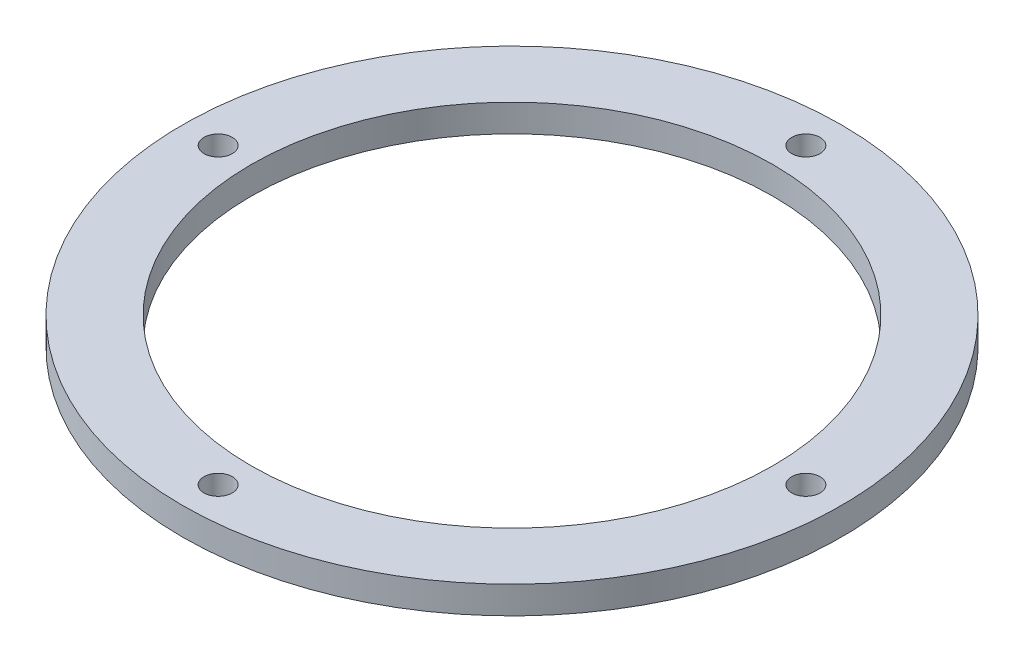
ISO-10303-21;
HEADER;
FILE_DESCRIPTION(('STEP AP214'),'2;1');
FILE_NAME('part.step','',(''),(''),'','','');
FILE_SCHEMA(('AUTOMOTIVE_DESIGN { 1 0 10303 214 1 1 1 1 }'));
ENDSEC;
DATA;
#1=APPLICATION_CONTEXT('core data for automotive mechanical design processes');
#2=APPLICATION_PROTOCOL_DEFINITION('international standard','automotive_design',2000,#1);
#3=PRODUCT_CONTEXT('',#1,'mechanical');
#4=PRODUCT('Part','Part','',(#3));
#5=PRODUCT_RELATED_PRODUCT_CATEGORY('part','',(#4));
#6=PRODUCT_DEFINITION_FORMATION('','',#4);
#7=PRODUCT_DEFINITION_CONTEXT('part definition',#1,'design');
#8=PRODUCT_DEFINITION('design','',#6,#7);
#9=PRODUCT_DEFINITION_SHAPE('','',#8);
#10=(LENGTH_UNIT() NAMED_UNIT(*) SI_UNIT(.MILLI.,.METRE.));
#11=(NAMED_UNIT(*) PLANE_ANGLE_UNIT() SI_UNIT($,.RADIAN.));
#12=(NAMED_UNIT(*) SI_UNIT($,.STERADIAN.) SOLID_ANGLE_UNIT());
#13=UNCERTAINTY_MEASURE_WITH_UNIT(LENGTH_MEASURE(1.E-05),#10,'distance_accuracy_value','');
#14=(GEOMETRIC_REPRESENTATION_CONTEXT(3) GLOBAL_UNCERTAINTY_ASSIGNED_CONTEXT((#13)) GLOBAL_UNIT_ASSIGNED_CONTEXT((#10,
#11,#12)) REPRESENTATION_CONTEXT('',''));
#15=CARTESIAN_POINT('',(0.,0.,0.));
#16=DIRECTION('',(0.,0.,1.));
#17=DIRECTION('',(1.,0.,0.));
#18=AXIS2_PLACEMENT_3D('',#15,#16,#17);
#19=CARTESIAN_POINT('',(0.,5.,0.));
#20=DIRECTION('',(0.,1.,0.));
#21=DIRECTION('',(0.,0.,1.));
#22=AXIS2_PLACEMENT_3D('',#19,#20,#21);
#23=PLANE('',#22);
#24=CARTESIAN_POINT('',(0.,5.,-53.5));
#25=DIRECTION('',(0.,1.,0.));
#26=DIRECTION('',(0.,0.,1.));
#27=AXIS2_PLACEMENT_3D('',#24,#25,#26);
#28=CIRCLE('',#27,2.575);
#29=CARTESIAN_POINT('',(0.,5.,-50.925));
#30=VERTEX_POINT('',#29);
#31=EDGE_CURVE('E85',#30,#30,#28,.T.);
#32=ORIENTED_EDGE('',*,*,#31,.F.);
#33=EDGE_LOOP('',(#32));
#34=FACE_BOUND('',#33,.T.);
#35=CARTESIAN_POINT('',(53.5,5.,1.86794251628108E-13));
#36=DIRECTION('',(0.,1.,0.));
#37=DIRECTION('',(0.,0.,1.));
#38=AXIS2_PLACEMENT_3D('',#35,#36,#37);
#39=CIRCLE('',#38,2.575);
#40=CARTESIAN_POINT('',(53.5,5.,2.57500000000019));
#41=VERTEX_POINT('',#40);
#42=EDGE_CURVE('E81',#41,#41,#39,.T.);
#43=ORIENTED_EDGE('',*,*,#42,.F.);
#44=EDGE_LOOP('',(#43));
#45=FACE_BOUND('',#44,.T.);
#46=CARTESIAN_POINT('',(-3.73588503256215E-13,5.,53.5));
#47=DIRECTION('',(0.,1.,0.));
#48=DIRECTION('',(0.,0.,1.));
#49=AXIS2_PLACEMENT_3D('',#46,#47,#48);
#50=CIRCLE('',#49,2.575);
#51=CARTESIAN_POINT('',(-3.73588503256215E-13,5.,56.075));
#52=VERTEX_POINT('',#51);
#53=EDGE_CURVE('E73',#52,#52,#50,.T.);
#54=ORIENTED_EDGE('',*,*,#53,.F.);
#55=EDGE_LOOP('',(#54));
#56=FACE_BOUND('',#55,.T.);
#57=CARTESIAN_POINT('',(-53.5,5.,-5.60382754884323E-13));
#58=DIRECTION('',(0.,1.,0.));
#59=DIRECTION('',(0.,0.,1.));
#60=AXIS2_PLACEMENT_3D('',#57,#58,#59);
#61=CIRCLE('',#60,2.575);
#62=CARTESIAN_POINT('',(-53.5,5.,2.57499999999944));
#63=VERTEX_POINT('',#62);
#64=EDGE_CURVE('E64',#63,#63,#61,.T.);
#65=ORIENTED_EDGE('',*,*,#64,.F.);
#66=EDGE_LOOP('',(#65));
#67=FACE_BOUND('',#66,.T.);
#68=CARTESIAN_POINT('',(0.,5.,0.));
#69=DIRECTION('',(0.,1.,0.));
#70=DIRECTION('',(0.,0.,1.));
#71=AXIS2_PLACEMENT_3D('',#68,#69,#70);
#72=CIRCLE('',#71,60.);
#73=CARTESIAN_POINT('',(0.,5.,60.));
#74=VERTEX_POINT('',#73);
#75=EDGE_CURVE('E10',#74,#74,#72,.T.);
#76=ORIENTED_EDGE('',*,*,#75,.T.);
#77=EDGE_LOOP('',(#76));
#78=FACE_BOUND('',#77,.T.);
#79=CARTESIAN_POINT('',(0.,5.,0.));
#80=DIRECTION('',(0.,1.,0.));
#81=DIRECTION('',(0.,0.,1.));
#82=AXIS2_PLACEMENT_3D('',#79,#80,#81);
#83=CIRCLE('',#82,47.5);
#84=CARTESIAN_POINT('',(0.,5.,47.5));
#85=VERTEX_POINT('',#84);
#86=EDGE_CURVE('E54',#85,#85,#83,.T.);
#87=ORIENTED_EDGE('',*,*,#86,.F.);
#88=EDGE_LOOP('',(#87));
#89=FACE_BOUND('',#88,.T.);
#90=ADVANCED_FACE('F41',(#34,#45,#56,#67,#78,#89),#23,.T.);
#91=CARTESIAN_POINT('',(0.,0.,0.));
#92=DIRECTION('',(0.,1.,0.));
#93=DIRECTION('',(0.,0.,1.));
#94=AXIS2_PLACEMENT_3D('',#91,#92,#93);
#95=PLANE('',#94);
#96=CARTESIAN_POINT('',(0.,0.,-53.5));
#97=DIRECTION('',(0.,1.,0.));
#98=DIRECTION('',(0.,0.,1.));
#99=AXIS2_PLACEMENT_3D('',#96,#97,#98);
#100=CIRCLE('',#99,2.575);
#101=CARTESIAN_POINT('',(0.,0.,-50.925));
#102=VERTEX_POINT('',#101);
#103=EDGE_CURVE('E60',#102,#102,#100,.F.);
#104=ORIENTED_EDGE('',*,*,#103,.F.);
#105=EDGE_LOOP('',(#104));
#106=FACE_BOUND('',#105,.T.);
#107=CARTESIAN_POINT('',(53.5,0.,1.86794251628108E-13));
#108=DIRECTION('',(0.,1.,0.));
#109=DIRECTION('',(0.,0.,1.));
#110=AXIS2_PLACEMENT_3D('',#107,#108,#109);
#111=CIRCLE('',#110,2.575);
#112=CARTESIAN_POINT('',(53.5,0.,2.57500000000019));
#113=VERTEX_POINT('',#112);
#114=EDGE_CURVE('E77',#113,#113,#111,.F.);
#115=ORIENTED_EDGE('',*,*,#114,.F.);
#116=EDGE_LOOP('',(#115));
#117=FACE_BOUND('',#116,.T.);
#118=CARTESIAN_POINT('',(-3.73588503256215E-13,0.,53.5));
#119=DIRECTION('',(0.,1.,0.));
#120=DIRECTION('',(0.,0.,1.));
#121=AXIS2_PLACEMENT_3D('',#118,#119,#120);
#122=CIRCLE('',#121,2.575);
#123=CARTESIAN_POINT('',(-3.73588503256215E-13,0.,56.075));
#124=VERTEX_POINT('',#123);
#125=EDGE_CURVE('E68',#124,#124,#122,.F.);
#126=ORIENTED_EDGE('',*,*,#125,.F.);
#127=EDGE_LOOP('',(#126));
#128=FACE_BOUND('',#127,.T.);
#129=CARTESIAN_POINT('',(-53.5,0.,-5.60382754884323E-13));
#130=DIRECTION('',(0.,1.,0.));
#131=DIRECTION('',(0.,0.,1.));
#132=AXIS2_PLACEMENT_3D('',#129,#130,#131);
#133=CIRCLE('',#132,2.575);
#134=CARTESIAN_POINT('',(-53.5,0.,2.57499999999944));
#135=VERTEX_POINT('',#134);
#136=EDGE_CURVE('E69',#135,#135,#133,.F.);
#137=ORIENTED_EDGE('',*,*,#136,.F.);
#138=EDGE_LOOP('',(#137));
#139=FACE_BOUND('',#138,.T.);
#140=CARTESIAN_POINT('',(0.,0.,0.));
#141=DIRECTION('',(0.,1.,0.));
#142=DIRECTION('',(0.,0.,1.));
#143=AXIS2_PLACEMENT_3D('',#140,#141,#142);
#144=CIRCLE('',#143,60.);
#145=CARTESIAN_POINT('',(0.,0.,60.));
#146=VERTEX_POINT('',#145);
#147=EDGE_CURVE('E45',#146,#146,#144,.T.);
#148=ORIENTED_EDGE('',*,*,#147,.F.);
#149=EDGE_LOOP('',(#148));
#150=FACE_BOUND('',#149,.T.);
#151=CARTESIAN_POINT('',(0.,0.,0.));
#152=DIRECTION('',(0.,1.,0.));
#153=DIRECTION('',(0.,0.,1.));
#154=AXIS2_PLACEMENT_3D('',#151,#152,#153);
#155=CIRCLE('',#154,47.5);
#156=CARTESIAN_POINT('',(0.,0.,47.5));
#157=VERTEX_POINT('',#156);
#158=EDGE_CURVE('E56',#157,#157,#155,.T.);
#159=ORIENTED_EDGE('',*,*,#158,.T.);
#160=EDGE_LOOP('',(#159));
#161=FACE_BOUND('',#160,.T.);
#162=ADVANCED_FACE('F101',(#106,#117,#128,#139,#150,#161),#95,.F.);
#163=CARTESIAN_POINT('',(0.,5.,0.));
#164=DIRECTION('',(0.,-1.,0.));
#165=DIRECTION('',(0.,0.,-1.));
#166=AXIS2_PLACEMENT_3D('',#163,#164,#165);
#167=CYLINDRICAL_SURFACE('',#166,60.);
#168=ORIENTED_EDGE('',*,*,#75,.F.);
#169=EDGE_LOOP('',(#168));
#170=FACE_BOUND('',#169,.T.);
#171=ORIENTED_EDGE('',*,*,#147,.T.);
#172=EDGE_LOOP('',(#171));
#173=FACE_BOUND('',#172,.T.);
#174=ADVANCED_FACE('F43',(#170,#173),#167,.T.);
#175=CARTESIAN_POINT('',(0.,5.,0.));
#176=DIRECTION('',(0.,-1.,0.));
#177=DIRECTION('',(0.,0.,-1.));
#178=AXIS2_PLACEMENT_3D('',#175,#176,#177);
#179=CYLINDRICAL_SURFACE('',#178,47.5);
#180=ORIENTED_EDGE('',*,*,#86,.T.);
#181=EDGE_LOOP('',(#180));
#182=FACE_BOUND('',#181,.T.);
#183=ORIENTED_EDGE('',*,*,#158,.F.);
#184=EDGE_LOOP('',(#183));
#185=FACE_BOUND('',#184,.T.);
#186=ADVANCED_FACE('F111',(#182,#185),#179,.F.);
#187=CARTESIAN_POINT('',(-53.5,-0.00100000000000013,-5.60382754884323E-13));
#188=DIRECTION('',(0.,1.,0.));
#189=DIRECTION('',(0.,0.,1.));
#190=AXIS2_PLACEMENT_3D('',#187,#188,#189);
#191=CYLINDRICAL_SURFACE('',#190,2.575);
#192=ORIENTED_EDGE('',*,*,#64,.T.);
#193=EDGE_LOOP('',(#192));
#194=FACE_BOUND('',#193,.T.);
#195=ORIENTED_EDGE('',*,*,#136,.T.);
#196=EDGE_LOOP('',(#195));
#197=FACE_BOUND('',#196,.T.);
#198=ADVANCED_FACE('F114',(#194,#197),#191,.F.);
#199=CARTESIAN_POINT('',(-3.73588503256215E-13,-0.00100000000000013,53.5));
#200=DIRECTION('',(0.,1.,0.));
#201=DIRECTION('',(0.,0.,1.));
#202=AXIS2_PLACEMENT_3D('',#199,#200,#201);
#203=CYLINDRICAL_SURFACE('',#202,2.575);
#204=ORIENTED_EDGE('',*,*,#53,.T.);
#205=EDGE_LOOP('',(#204));
#206=FACE_BOUND('',#205,.T.);
#207=ORIENTED_EDGE('',*,*,#125,.T.);
#208=EDGE_LOOP('',(#207));
#209=FACE_BOUND('',#208,.T.);
#210=ADVANCED_FACE('F129',(#206,#209),#203,.F.);
#211=CARTESIAN_POINT('',(53.5,-0.00100000000000013,1.86794251628108E-13));
#212=DIRECTION('',(0.,1.,0.));
#213=DIRECTION('',(0.,0.,1.));
#214=AXIS2_PLACEMENT_3D('',#211,#212,#213);
#215=CYLINDRICAL_SURFACE('',#214,2.575);
#216=ORIENTED_EDGE('',*,*,#42,.T.);
#217=EDGE_LOOP('',(#216));
#218=FACE_BOUND('',#217,.T.);
#219=ORIENTED_EDGE('',*,*,#114,.T.);
#220=EDGE_LOOP('',(#219));
#221=FACE_BOUND('',#220,.T.);
#222=ADVANCED_FACE('F133',(#218,#221),#215,.F.);
#223=CARTESIAN_POINT('',(0.,-0.00100000000000013,-53.5));
#224=DIRECTION('',(0.,1.,0.));
#225=DIRECTION('',(0.,0.,1.));
#226=AXIS2_PLACEMENT_3D('',#223,#224,#225);
#227=CYLINDRICAL_SURFACE('',#226,2.575);
#228=ORIENTED_EDGE('',*,*,#31,.T.);
#229=EDGE_LOOP('',(#228));
#230=FACE_BOUND('',#229,.T.);
#231=ORIENTED_EDGE('',*,*,#103,.T.);
#232=EDGE_LOOP('',(#231));
#233=FACE_BOUND('',#232,.T.);
#234=ADVANCED_FACE('F96',(#230,#233),#227,.F.);
#235=CLOSED_SHELL('',(#90,#162,#174,#186,#198,#210,#222,#234));
#236=MANIFOLD_SOLID_BREP('B2',#235);
#237=ADVANCED_BREP_SHAPE_REPRESENTATION('',(#18,#236),#14);
#238=SHAPE_DEFINITION_REPRESENTATION(#9,#237);
ENDSEC;
END-ISO-10303-21;
